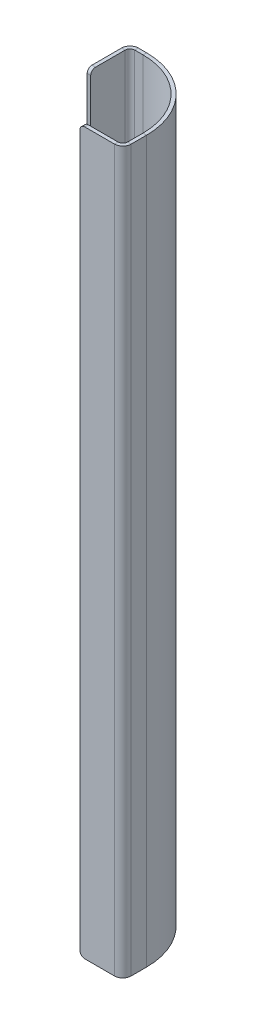
ISO-10303-21;
HEADER;
FILE_DESCRIPTION(('STEP AP214'),'2;1');
FILE_NAME('part.step','',(''),(''),'','','');
FILE_SCHEMA(('AUTOMOTIVE_DESIGN { 1 0 10303 214 1 1 1 1 }'));
ENDSEC;
DATA;
#1=APPLICATION_CONTEXT('core data for automotive mechanical design processes');
#2=APPLICATION_PROTOCOL_DEFINITION('international standard','automotive_design',2000,#1);
#3=PRODUCT_CONTEXT('',#1,'mechanical');
#4=PRODUCT('Part','Part','',(#3));
#5=PRODUCT_RELATED_PRODUCT_CATEGORY('part','',(#4));
#6=PRODUCT_DEFINITION_FORMATION('','',#4);
#7=PRODUCT_DEFINITION_CONTEXT('part definition',#1,'design');
#8=PRODUCT_DEFINITION('design','',#6,#7);
#9=PRODUCT_DEFINITION_SHAPE('','',#8);
#10=(LENGTH_UNIT() NAMED_UNIT(*) SI_UNIT(.MILLI.,.METRE.));
#11=(NAMED_UNIT(*) PLANE_ANGLE_UNIT() SI_UNIT($,.RADIAN.));
#12=(NAMED_UNIT(*) SI_UNIT($,.STERADIAN.) SOLID_ANGLE_UNIT());
#13=UNCERTAINTY_MEASURE_WITH_UNIT(LENGTH_MEASURE(1.E-05),#10,'distance_accuracy_value','');
#14=(GEOMETRIC_REPRESENTATION_CONTEXT(3) GLOBAL_UNCERTAINTY_ASSIGNED_CONTEXT((#13)) GLOBAL_UNIT_ASSIGNED_CONTEXT((#10,
#11,#12)) REPRESENTATION_CONTEXT('',''));
#15=CARTESIAN_POINT('',(0.,0.,0.));
#16=DIRECTION('',(0.,0.,1.));
#17=DIRECTION('',(1.,0.,0.));
#18=AXIS2_PLACEMENT_3D('',#15,#16,#17);
#19=CARTESIAN_POINT('',(0.,303.,-1.5));
#20=DIRECTION('',(0.,1.,0.));
#21=DIRECTION('',(0.,0.,1.));
#22=AXIS2_PLACEMENT_3D('',#19,#20,#21);
#23=PLANE('',#22);
#24=DIRECTION('',(-1.,0.,0.));
#25=VECTOR('',#24,1.);
#26=CARTESIAN_POINT('',(0.,303.,0.));
#27=LINE('',#26,#25);
#28=CARTESIAN_POINT('',(3.5,303.,0.));
#29=VERTEX_POINT('',#28);
#30=CARTESIAN_POINT('',(0.,303.,0.));
#31=VERTEX_POINT('',#30);
#32=EDGE_CURVE('E377',#29,#31,#27,.T.);
#33=ORIENTED_EDGE('',*,*,#32,.F.);
#34=DIRECTION('',(0.,0.,1.));
#35=VECTOR('',#34,1.);
#36=CARTESIAN_POINT('',(3.5,303.,-1.5));
#37=LINE('',#36,#35);
#38=CARTESIAN_POINT('',(3.5,303.,-1.5));
#39=VERTEX_POINT('',#38);
#40=EDGE_CURVE('E399',#39,#29,#37,.T.);
#41=ORIENTED_EDGE('',*,*,#40,.F.);
#42=DIRECTION('',(-1.,0.,0.));
#43=VECTOR('',#42,1.);
#44=CARTESIAN_POINT('',(0.,303.,-1.5));
#45=LINE('',#44,#43);
#46=CARTESIAN_POINT('',(0.,303.,-1.5));
#47=VERTEX_POINT('',#46);
#48=EDGE_CURVE('E383',#39,#47,#45,.T.);
#49=ORIENTED_EDGE('',*,*,#48,.T.);
#50=DIRECTION('',(0.,0.,1.));
#51=VECTOR('',#50,1.);
#52=CARTESIAN_POINT('',(0.,303.,-1.5));
#53=LINE('',#52,#51);
#54=EDGE_CURVE('E396',#47,#31,#53,.T.);
#55=ORIENTED_EDGE('',*,*,#54,.T.);
#56=EDGE_LOOP('',(#33,#41,#49,#55));
#57=FACE_BOUND('',#56,.T.);
#58=ADVANCED_FACE('F97',(#57),#23,.T.);
#59=CARTESIAN_POINT('',(0.,0.,-1.5));
#60=DIRECTION('',(0.,-1.,0.));
#61=DIRECTION('',(0.,0.,-1.));
#62=AXIS2_PLACEMENT_3D('',#59,#60,#61);
#63=PLANE('',#62);
#64=DIRECTION('',(1.,0.,0.));
#65=VECTOR('',#64,1.);
#66=CARTESIAN_POINT('',(0.,0.,0.));
#67=LINE('',#66,#65);
#68=CARTESIAN_POINT('',(0.,0.,0.));
#69=VERTEX_POINT('',#68);
#70=CARTESIAN_POINT('',(3.5,0.,0.));
#71=VERTEX_POINT('',#70);
#72=EDGE_CURVE('E389',#69,#71,#67,.T.);
#73=ORIENTED_EDGE('',*,*,#72,.F.);
#74=DIRECTION('',(0.,0.,1.));
#75=VECTOR('',#74,1.);
#76=CARTESIAN_POINT('',(0.,0.,-1.5));
#77=LINE('',#76,#75);
#78=CARTESIAN_POINT('',(0.,0.,-1.5));
#79=VERTEX_POINT('',#78);
#80=EDGE_CURVE('E386',#79,#69,#77,.T.);
#81=ORIENTED_EDGE('',*,*,#80,.F.);
#82=DIRECTION('',(1.,0.,0.));
#83=VECTOR('',#82,1.);
#84=CARTESIAN_POINT('',(0.,0.,-1.5));
#85=LINE('',#84,#83);
#86=CARTESIAN_POINT('',(3.5,0.,-1.5));
#87=VERTEX_POINT('',#86);
#88=EDGE_CURVE('E376',#79,#87,#85,.T.);
#89=ORIENTED_EDGE('',*,*,#88,.T.);
#90=DIRECTION('',(0.,0.,1.));
#91=VECTOR('',#90,1.);
#92=CARTESIAN_POINT('',(3.5,0.,-1.5));
#93=LINE('',#92,#91);
#94=EDGE_CURVE('E402',#87,#71,#93,.T.);
#95=ORIENTED_EDGE('',*,*,#94,.T.);
#96=EDGE_LOOP('',(#73,#81,#89,#95));
#97=FACE_BOUND('',#96,.T.);
#98=ADVANCED_FACE('F486',(#97),#63,.T.);
#99=CARTESIAN_POINT('',(0.,0.,-1.5));
#100=DIRECTION('',(0.,0.,-1.));
#101=DIRECTION('',(-1.,0.,0.));
#102=AXIS2_PLACEMENT_3D('',#99,#100,#101);
#103=PLANE('',#102);
#104=DIRECTION('',(0.,-1.,0.));
#105=VECTOR('',#104,1.);
#106=CARTESIAN_POINT('',(0.,0.,-1.5));
#107=LINE('',#106,#105);
#108=EDGE_CURVE('E373',#47,#79,#107,.T.);
#109=ORIENTED_EDGE('',*,*,#108,.F.);
#110=ORIENTED_EDGE('',*,*,#48,.F.);
#111=DIRECTION('',(0.,1.,0.));
#112=VECTOR('',#111,1.);
#113=CARTESIAN_POINT('',(3.5,0.,-1.5));
#114=LINE('',#113,#112);
#115=EDGE_CURVE('E380',#87,#39,#114,.T.);
#116=ORIENTED_EDGE('',*,*,#115,.F.);
#117=ORIENTED_EDGE('',*,*,#88,.F.);
#118=EDGE_LOOP('',(#109,#110,#116,#117));
#119=FACE_BOUND('',#118,.T.);
#120=ADVANCED_FACE('F491',(#119),#103,.T.);
#121=CARTESIAN_POINT('',(0.,0.,0.));
#122=DIRECTION('',(0.,0.,-1.));
#123=DIRECTION('',(-1.,0.,0.));
#124=AXIS2_PLACEMENT_3D('',#121,#122,#123);
#125=PLANE('',#124);
#126=DIRECTION('',(0.,-1.,0.));
#127=VECTOR('',#126,1.);
#128=CARTESIAN_POINT('',(0.,0.,0.));
#129=LINE('',#128,#127);
#130=EDGE_CURVE('E364',#31,#69,#129,.T.);
#131=ORIENTED_EDGE('',*,*,#130,.T.);
#132=ORIENTED_EDGE('',*,*,#72,.T.);
#133=DIRECTION('',(0.,1.,0.));
#134=VECTOR('',#133,1.);
#135=CARTESIAN_POINT('',(3.5,0.,0.));
#136=LINE('',#135,#134);
#137=EDGE_CURVE('E392',#71,#29,#136,.T.);
#138=ORIENTED_EDGE('',*,*,#137,.T.);
#139=ORIENTED_EDGE('',*,*,#32,.T.);
#140=EDGE_LOOP('',(#131,#132,#138,#139));
#141=FACE_BOUND('',#140,.T.);
#142=ADVANCED_FACE('F472',(#141),#125,.F.);
#143=CARTESIAN_POINT('',(3.49999999999999,0.,28.5));
#144=DIRECTION('',(0.,-1.,0.));
#145=DIRECTION('',(0.,0.,-1.));
#146=AXIS2_PLACEMENT_3D('',#143,#144,#145);
#147=PLANE('',#146);
#148=DIRECTION('',(1.,0.,0.));
#149=VECTOR('',#148,1.);
#150=CARTESIAN_POINT('',(33.5,0.,28.4999999999999));
#151=LINE('',#150,#149);
#152=CARTESIAN_POINT('',(32.,0.,28.4999999999999));
#153=VERTEX_POINT('',#152);
#154=CARTESIAN_POINT('',(33.5,0.,28.4999999999999));
#155=VERTEX_POINT('',#154);
#156=EDGE_CURVE('E323',#153,#155,#151,.T.);
#157=ORIENTED_EDGE('',*,*,#156,.F.);
#158=CARTESIAN_POINT('',(3.49999999999999,0.,28.5));
#159=DIRECTION('',(0.,1.,0.));
#160=DIRECTION('',(0.,0.,1.));
#161=AXIS2_PLACEMENT_3D('',#158,#159,#160);
#162=CIRCLE('',#161,28.5);
#163=EDGE_CURVE('E368',#71,#153,#162,.F.);
#164=ORIENTED_EDGE('',*,*,#163,.F.);
#165=ORIENTED_EDGE('',*,*,#94,.F.);
#166=CARTESIAN_POINT('',(3.49999999999999,0.,28.5));
#167=DIRECTION('',(0.,1.,0.));
#168=DIRECTION('',(0.,0.,1.));
#169=AXIS2_PLACEMENT_3D('',#166,#167,#168);
#170=CIRCLE('',#169,30.);
#171=EDGE_CURVE('E361',#87,#155,#170,.F.);
#172=ORIENTED_EDGE('',*,*,#171,.T.);
#173=EDGE_LOOP('',(#157,#164,#165,#172));
#174=FACE_BOUND('',#173,.T.);
#175=ADVANCED_FACE('F780',(#174),#147,.T.);
#176=CARTESIAN_POINT('',(3.50000000000001,303.,28.5));
#177=DIRECTION('',(0.,-1.,0.));
#178=DIRECTION('',(0.,0.,-1.));
#179=AXIS2_PLACEMENT_3D('',#176,#177,#178);
#180=PLANE('',#179);
#181=CARTESIAN_POINT('',(3.50000000000001,303.,28.5));
#182=DIRECTION('',(0.,1.,0.));
#183=DIRECTION('',(0.,0.,1.));
#184=AXIS2_PLACEMENT_3D('',#181,#182,#183);
#185=CIRCLE('',#184,28.5);
#186=CARTESIAN_POINT('',(32.,303.,28.4999999999999));
#187=VERTEX_POINT('',#186);
#188=EDGE_CURVE('E334',#187,#29,#185,.T.);
#189=ORIENTED_EDGE('',*,*,#188,.F.);
#190=DIRECTION('',(1.,0.,0.));
#191=VECTOR('',#190,1.);
#192=CARTESIAN_POINT('',(32.,303.,28.4999999999999));
#193=LINE('',#192,#191);
#194=CARTESIAN_POINT('',(33.5,303.,28.4999999999999));
#195=VERTEX_POINT('',#194);
#196=EDGE_CURVE('E354',#187,#195,#193,.T.);
#197=ORIENTED_EDGE('',*,*,#196,.T.);
#198=CARTESIAN_POINT('',(3.50000000000001,303.,28.5));
#199=DIRECTION('',(0.,1.,0.));
#200=DIRECTION('',(0.,0.,1.));
#201=AXIS2_PLACEMENT_3D('',#198,#199,#200);
#202=CIRCLE('',#201,30.);
#203=EDGE_CURVE('E365',#195,#39,#202,.T.);
#204=ORIENTED_EDGE('',*,*,#203,.T.);
#205=ORIENTED_EDGE('',*,*,#40,.T.);
#206=EDGE_LOOP('',(#189,#197,#204,#205));
#207=FACE_BOUND('',#206,.T.);
#208=ADVANCED_FACE('F770',(#207),#180,.F.);
#209=CARTESIAN_POINT('',(3.50000000000001,303.,28.5));
#210=DIRECTION('',(0.,1.,0.));
#211=DIRECTION('',(1.,0.,0.));
#212=AXIS2_PLACEMENT_3D('',#209,#210,#211);
#213=CYLINDRICAL_SURFACE('',#212,30.);
#214=ORIENTED_EDGE('',*,*,#115,.T.);
#215=ORIENTED_EDGE('',*,*,#203,.F.);
#216=DIRECTION('',(0.,1.,0.));
#217=VECTOR('',#216,1.);
#218=CARTESIAN_POINT('',(33.5,0.,28.4999999999999));
#219=LINE('',#218,#217);
#220=EDGE_CURVE('E351',#155,#195,#219,.T.);
#221=ORIENTED_EDGE('',*,*,#220,.F.);
#222=ORIENTED_EDGE('',*,*,#171,.F.);
#223=EDGE_LOOP('',(#214,#215,#221,#222));
#224=FACE_BOUND('',#223,.T.);
#225=ADVANCED_FACE('F760',(#224),#213,.T.);
#226=CARTESIAN_POINT('',(3.50000000000001,303.,28.5));
#227=DIRECTION('',(0.,1.,0.));
#228=DIRECTION('',(1.,0.,0.));
#229=AXIS2_PLACEMENT_3D('',#226,#227,#228);
#230=CYLINDRICAL_SURFACE('',#229,28.5);
#231=ORIENTED_EDGE('',*,*,#137,.F.);
#232=ORIENTED_EDGE('',*,*,#163,.T.);
#233=DIRECTION('',(0.,-1.,0.));
#234=VECTOR('',#233,1.);
#235=CARTESIAN_POINT('',(32.,0.,28.4999999999999));
#236=LINE('',#235,#234);
#237=EDGE_CURVE('E357',#153,#187,#236,.F.);
#238=ORIENTED_EDGE('',*,*,#237,.T.);
#239=ORIENTED_EDGE('',*,*,#188,.T.);
#240=EDGE_LOOP('',(#231,#232,#238,#239));
#241=FACE_BOUND('',#240,.T.);
#242=ADVANCED_FACE('F750',(#241),#230,.F.);
#243=CARTESIAN_POINT('',(33.4999999999999,303.,0.));
#244=DIRECTION('',(0.,1.,0.));
#245=DIRECTION('',(0.,0.,1.));
#246=AXIS2_PLACEMENT_3D('',#243,#244,#245);
#247=PLANE('',#246);
#248=DIRECTION('',(0.,0.,-1.));
#249=VECTOR('',#248,1.);
#250=CARTESIAN_POINT('',(33.4999999999999,303.,0.));
#251=LINE('',#250,#249);
#252=CARTESIAN_POINT('',(33.5,303.,35.));
#253=VERTEX_POINT('',#252);
#254=EDGE_CURVE('E338',#253,#195,#251,.T.);
#255=ORIENTED_EDGE('',*,*,#254,.T.);
#256=ORIENTED_EDGE('',*,*,#196,.F.);
#257=DIRECTION('',(0.,0.,1.));
#258=VECTOR('',#257,1.);
#259=CARTESIAN_POINT('',(31.9999999999999,303.,0.));
#260=LINE('',#259,#258);
#261=CARTESIAN_POINT('',(32.,303.,35.));
#262=VERTEX_POINT('',#261);
#263=EDGE_CURVE('E344',#262,#187,#260,.F.);
#264=ORIENTED_EDGE('',*,*,#263,.F.);
#265=DIRECTION('',(-1.,0.,0.));
#266=VECTOR('',#265,1.);
#267=CARTESIAN_POINT('',(33.5,303.,35.));
#268=LINE('',#267,#266);
#269=EDGE_CURVE('E332',#253,#262,#268,.T.);
#270=ORIENTED_EDGE('',*,*,#269,.F.);
#271=EDGE_LOOP('',(#255,#256,#264,#270));
#272=FACE_BOUND('',#271,.T.);
#273=ADVANCED_FACE('F740',(#272),#247,.T.);
#274=CARTESIAN_POINT('',(33.5,0.,35.));
#275=DIRECTION('',(0.,-1.,0.));
#276=DIRECTION('',(0.,0.,-1.));
#277=AXIS2_PLACEMENT_3D('',#274,#275,#276);
#278=PLANE('',#277);
#279=DIRECTION('',(0.,0.,-1.));
#280=VECTOR('',#279,1.);
#281=CARTESIAN_POINT('',(31.9999999999999,0.,0.));
#282=LINE('',#281,#280);
#283=CARTESIAN_POINT('',(32.,0.,35.));
#284=VERTEX_POINT('',#283);
#285=EDGE_CURVE('E349',#153,#284,#282,.F.);
#286=ORIENTED_EDGE('',*,*,#285,.F.);
#287=ORIENTED_EDGE('',*,*,#156,.T.);
#288=DIRECTION('',(0.,0.,1.));
#289=VECTOR('',#288,1.);
#290=CARTESIAN_POINT('',(33.5,0.,35.));
#291=LINE('',#290,#289);
#292=CARTESIAN_POINT('',(33.5,0.,35.));
#293=VERTEX_POINT('',#292);
#294=EDGE_CURVE('E342',#155,#293,#291,.T.);
#295=ORIENTED_EDGE('',*,*,#294,.T.);
#296=DIRECTION('',(-1.,0.,0.));
#297=VECTOR('',#296,1.);
#298=CARTESIAN_POINT('',(33.5,0.,35.));
#299=LINE('',#298,#297);
#300=EDGE_CURVE('E335',#293,#284,#299,.T.);
#301=ORIENTED_EDGE('',*,*,#300,.T.);
#302=EDGE_LOOP('',(#286,#287,#295,#301));
#303=FACE_BOUND('',#302,.T.);
#304=ADVANCED_FACE('F730',(#303),#278,.T.);
#305=CARTESIAN_POINT('',(33.4999999999999,0.,0.));
#306=DIRECTION('',(1.,0.,0.));
#307=DIRECTION('',(0.,0.,-1.));
#308=AXIS2_PLACEMENT_3D('',#305,#306,#307);
#309=PLANE('',#308);
#310=ORIENTED_EDGE('',*,*,#294,.F.);
#311=ORIENTED_EDGE('',*,*,#220,.T.);
#312=ORIENTED_EDGE('',*,*,#254,.F.);
#313=DIRECTION('',(0.,1.,0.));
#314=VECTOR('',#313,1.);
#315=CARTESIAN_POINT('',(33.5,303.,35.));
#316=LINE('',#315,#314);
#317=EDGE_CURVE('E246',#293,#253,#316,.T.);
#318=ORIENTED_EDGE('',*,*,#317,.F.);
#319=EDGE_LOOP('',(#310,#311,#312,#318));
#320=FACE_BOUND('',#319,.T.);
#321=ADVANCED_FACE('F721',(#320),#309,.T.);
#322=CARTESIAN_POINT('',(31.9999999999999,0.,0.));
#323=DIRECTION('',(1.,0.,0.));
#324=DIRECTION('',(0.,0.,-1.));
#325=AXIS2_PLACEMENT_3D('',#322,#323,#324);
#326=PLANE('',#325);
#327=ORIENTED_EDGE('',*,*,#237,.F.);
#328=ORIENTED_EDGE('',*,*,#285,.T.);
#329=DIRECTION('',(0.,-1.,0.));
#330=VECTOR('',#329,1.);
#331=CARTESIAN_POINT('',(32.,0.,35.));
#332=LINE('',#331,#330);
#333=EDGE_CURVE('E347',#284,#262,#332,.F.);
#334=ORIENTED_EDGE('',*,*,#333,.T.);
#335=ORIENTED_EDGE('',*,*,#263,.T.);
#336=EDGE_LOOP('',(#327,#328,#334,#335));
#337=FACE_BOUND('',#336,.T.);
#338=ADVANCED_FACE('F713',(#337),#326,.F.);
#339=CARTESIAN_POINT('',(0.,303.,2.));
#340=DIRECTION('',(0.,1.,0.));
#341=DIRECTION('',(0.,0.,1.));
#342=AXIS2_PLACEMENT_3D('',#339,#340,#341);
#343=PLANE('',#342);
#344=DIRECTION('',(1.,0.,0.));
#345=VECTOR('',#344,1.);
#346=CARTESIAN_POINT('',(-3.5,303.,1.99999999999999));
#347=LINE('',#346,#345);
#348=CARTESIAN_POINT('',(-2.,303.,1.99999999999999));
#349=VERTEX_POINT('',#348);
#350=CARTESIAN_POINT('',(-3.5,303.,1.99999999999999));
#351=VERTEX_POINT('',#350);
#352=EDGE_CURVE('E292',#349,#351,#347,.F.);
#353=ORIENTED_EDGE('',*,*,#352,.F.);
#354=CARTESIAN_POINT('',(0.,303.,2.));
#355=DIRECTION('',(0.,-1.,0.));
#356=DIRECTION('',(0.,0.,-1.));
#357=AXIS2_PLACEMENT_3D('',#354,#355,#356);
#358=CIRCLE('',#357,2.);
#359=EDGE_CURVE('E327',#31,#349,#358,.F.);
#360=ORIENTED_EDGE('',*,*,#359,.F.);
#361=ORIENTED_EDGE('',*,*,#54,.F.);
#362=CARTESIAN_POINT('',(0.,303.,2.));
#363=DIRECTION('',(0.,-1.,0.));
#364=DIRECTION('',(0.,0.,-1.));
#365=AXIS2_PLACEMENT_3D('',#362,#363,#364);
#366=CIRCLE('',#365,3.5);
#367=EDGE_CURVE('E320',#47,#351,#366,.F.);
#368=ORIENTED_EDGE('',*,*,#367,.T.);
#369=EDGE_LOOP('',(#353,#360,#361,#368));
#370=FACE_BOUND('',#369,.T.);
#371=ADVANCED_FACE('F465',(#370),#343,.T.);
#372=CARTESIAN_POINT('',(0.,0.,2.));
#373=DIRECTION('',(0.,1.,0.));
#374=DIRECTION('',(0.,0.,1.));
#375=AXIS2_PLACEMENT_3D('',#372,#373,#374);
#376=PLANE('',#375);
#377=CARTESIAN_POINT('',(0.,0.,2.));
#378=DIRECTION('',(0.,-1.,0.));
#379=DIRECTION('',(0.,0.,-1.));
#380=AXIS2_PLACEMENT_3D('',#377,#378,#379);
#381=CIRCLE('',#380,2.);
#382=CARTESIAN_POINT('',(-2.,0.,1.99999999999999));
#383=VERTEX_POINT('',#382);
#384=EDGE_CURVE('E299',#383,#69,#381,.T.);
#385=ORIENTED_EDGE('',*,*,#384,.F.);
#386=DIRECTION('',(1.,0.,0.));
#387=VECTOR('',#386,1.);
#388=CARTESIAN_POINT('',(-2.,0.,1.99999999999999));
#389=LINE('',#388,#387);
#390=CARTESIAN_POINT('',(-3.5,0.,1.99999999999999));
#391=VERTEX_POINT('',#390);
#392=EDGE_CURVE('E313',#383,#391,#389,.F.);
#393=ORIENTED_EDGE('',*,*,#392,.T.);
#394=CARTESIAN_POINT('',(0.,0.,2.));
#395=DIRECTION('',(0.,-1.,0.));
#396=DIRECTION('',(0.,0.,-1.));
#397=AXIS2_PLACEMENT_3D('',#394,#395,#396);
#398=CIRCLE('',#397,3.5);
#399=EDGE_CURVE('E324',#391,#79,#398,.T.);
#400=ORIENTED_EDGE('',*,*,#399,.T.);
#401=ORIENTED_EDGE('',*,*,#80,.T.);
#402=EDGE_LOOP('',(#385,#393,#400,#401));
#403=FACE_BOUND('',#402,.T.);
#404=ADVANCED_FACE('F459',(#403),#376,.F.);
#405=CARTESIAN_POINT('',(0.,0.,2.));
#406=DIRECTION('',(0.,-1.,0.));
#407=DIRECTION('',(-1.,0.,0.));
#408=AXIS2_PLACEMENT_3D('',#405,#406,#407);
#409=CYLINDRICAL_SURFACE('',#408,3.5);
#410=ORIENTED_EDGE('',*,*,#108,.T.);
#411=ORIENTED_EDGE('',*,*,#399,.F.);
#412=DIRECTION('',(0.,-1.,0.));
#413=VECTOR('',#412,1.);
#414=CARTESIAN_POINT('',(-3.5,303.,1.99999999999999));
#415=LINE('',#414,#413);
#416=EDGE_CURVE('E310',#391,#351,#415,.F.);
#417=ORIENTED_EDGE('',*,*,#416,.T.);
#418=ORIENTED_EDGE('',*,*,#367,.F.);
#419=EDGE_LOOP('',(#410,#411,#417,#418));
#420=FACE_BOUND('',#419,.T.);
#421=ADVANCED_FACE('F462',(#420),#409,.T.);
#422=CARTESIAN_POINT('',(0.,0.,2.));
#423=DIRECTION('',(0.,-1.,0.));
#424=DIRECTION('',(-1.,0.,0.));
#425=AXIS2_PLACEMENT_3D('',#422,#423,#424);
#426=CYLINDRICAL_SURFACE('',#425,2.);
#427=ORIENTED_EDGE('',*,*,#130,.F.);
#428=ORIENTED_EDGE('',*,*,#359,.T.);
#429=DIRECTION('',(0.,-1.,0.));
#430=VECTOR('',#429,1.);
#431=CARTESIAN_POINT('',(-2.,303.,1.99999999999999));
#432=LINE('',#431,#430);
#433=EDGE_CURVE('E316',#349,#383,#432,.T.);
#434=ORIENTED_EDGE('',*,*,#433,.T.);
#435=ORIENTED_EDGE('',*,*,#384,.T.);
#436=EDGE_LOOP('',(#427,#428,#434,#435));
#437=FACE_BOUND('',#436,.T.);
#438=ADVANCED_FACE('F475',(#437),#426,.F.);
#439=CARTESIAN_POINT('',(-3.49999999999999,303.,0.));
#440=DIRECTION('',(0.,-1.,0.));
#441=DIRECTION('',(0.,0.,-1.));
#442=AXIS2_PLACEMENT_3D('',#439,#440,#441);
#443=PLANE('',#442);
#444=DIRECTION('',(0.,0.,-1.));
#445=VECTOR('',#444,1.);
#446=CARTESIAN_POINT('',(-3.49999999999999,303.,0.));
#447=LINE('',#446,#445);
#448=CARTESIAN_POINT('',(-3.50000000000004,303.,14.5));
#449=VERTEX_POINT('',#448);
#450=EDGE_CURVE('E302',#449,#351,#447,.T.);
#451=ORIENTED_EDGE('',*,*,#450,.F.);
#452=DIRECTION('',(1.,0.,0.));
#453=VECTOR('',#452,1.);
#454=CARTESIAN_POINT('',(-3.50000000000004,303.,14.5));
#455=LINE('',#454,#453);
#456=CARTESIAN_POINT('',(-2.00000000000004,303.,14.5));
#457=VERTEX_POINT('',#456);
#458=EDGE_CURVE('E419',#449,#457,#455,.T.);
#459=ORIENTED_EDGE('',*,*,#458,.T.);
#460=DIRECTION('',(0.,0.,1.));
#461=VECTOR('',#460,1.);
#462=CARTESIAN_POINT('',(-1.99999999999999,303.,0.));
#463=LINE('',#462,#461);
#464=EDGE_CURVE('E308',#457,#349,#463,.F.);
#465=ORIENTED_EDGE('',*,*,#464,.T.);
#466=ORIENTED_EDGE('',*,*,#352,.T.);
#467=EDGE_LOOP('',(#451,#459,#465,#466));
#468=FACE_BOUND('',#467,.T.);
#469=ADVANCED_FACE('F441',(#468),#443,.F.);
#470=CARTESIAN_POINT('',(-3.50000000000005,0.,16.5));
#471=DIRECTION('',(0.,1.,0.));
#472=DIRECTION('',(0.,0.,1.));
#473=AXIS2_PLACEMENT_3D('',#470,#471,#472);
#474=PLANE('',#473);
#475=DIRECTION('',(0.,0.,-1.));
#476=VECTOR('',#475,1.);
#477=CARTESIAN_POINT('',(-2.00000000000005,0.,16.5));
#478=LINE('',#477,#476);
#479=CARTESIAN_POINT('',(-2.00000000000004,0.,14.5));
#480=VERTEX_POINT('',#479);
#481=EDGE_CURVE('E306',#383,#480,#478,.F.);
#482=ORIENTED_EDGE('',*,*,#481,.T.);
#483=DIRECTION('',(1.,0.,0.));
#484=VECTOR('',#483,1.);
#485=CARTESIAN_POINT('',(-3.50000000000004,0.,14.5));
#486=LINE('',#485,#484);
#487=CARTESIAN_POINT('',(-3.50000000000004,0.,14.5));
#488=VERTEX_POINT('',#487);
#489=EDGE_CURVE('E105',#480,#488,#486,.F.);
#490=ORIENTED_EDGE('',*,*,#489,.T.);
#491=DIRECTION('',(0.,0.,1.));
#492=VECTOR('',#491,1.);
#493=CARTESIAN_POINT('',(-3.49999999999999,0.,0.));
#494=LINE('',#493,#492);
#495=EDGE_CURVE('E300',#391,#488,#494,.T.);
#496=ORIENTED_EDGE('',*,*,#495,.F.);
#497=ORIENTED_EDGE('',*,*,#392,.F.);
#498=EDGE_LOOP('',(#482,#490,#496,#497));
#499=FACE_BOUND('',#498,.T.);
#500=ADVANCED_FACE('F456',(#499),#474,.F.);
#501=CARTESIAN_POINT('',(-3.49999999999999,0.,0.));
#502=DIRECTION('',(1.,0.,0.));
#503=DIRECTION('',(0.,0.,-1.));
#504=AXIS2_PLACEMENT_3D('',#501,#502,#503);
#505=PLANE('',#504);
#506=DIRECTION('',(0.,1.,0.));
#507=VECTOR('',#506,1.);
#508=CARTESIAN_POINT('',(-3.50000000000005,0.,16.5));
#509=LINE('',#508,#507);
#510=CARTESIAN_POINT('',(-3.50000000000005,2.,16.5));
#511=VERTEX_POINT('',#510);
#512=CARTESIAN_POINT('',(-3.50000000000005,301.,16.5));
#513=VERTEX_POINT('',#512);
#514=EDGE_CURVE('E297',#511,#513,#509,.T.);
#515=ORIENTED_EDGE('',*,*,#514,.T.);
#516=CARTESIAN_POINT('',(-3.50000000000004,301.,14.5));
#517=DIRECTION('',(1.,0.,0.));
#518=DIRECTION('',(0.,0.,-1.));
#519=AXIS2_PLACEMENT_3D('',#516,#517,#518);
#520=CIRCLE('',#519,2.);
#521=EDGE_CURVE('E432',#513,#449,#520,.F.);
#522=ORIENTED_EDGE('',*,*,#521,.T.);
#523=ORIENTED_EDGE('',*,*,#450,.T.);
#524=ORIENTED_EDGE('',*,*,#416,.F.);
#525=ORIENTED_EDGE('',*,*,#495,.T.);
#526=CARTESIAN_POINT('',(-3.50000000000004,2.,14.5));
#527=DIRECTION('',(1.,0.,0.));
#528=DIRECTION('',(0.,0.,-1.));
#529=AXIS2_PLACEMENT_3D('',#526,#527,#528);
#530=CIRCLE('',#529,2.);
#531=EDGE_CURVE('E430',#488,#511,#530,.F.);
#532=ORIENTED_EDGE('',*,*,#531,.T.);
#533=EDGE_LOOP('',(#515,#522,#523,#524,#525,#532));
#534=FACE_BOUND('',#533,.T.);
#535=ADVANCED_FACE('F436',(#534),#505,.F.);
#536=CARTESIAN_POINT('',(-1.99999999999999,0.,0.));
#537=DIRECTION('',(1.,0.,0.));
#538=DIRECTION('',(0.,0.,-1.));
#539=AXIS2_PLACEMENT_3D('',#536,#537,#538);
#540=PLANE('',#539);
#541=ORIENTED_EDGE('',*,*,#464,.F.);
#542=CARTESIAN_POINT('',(-2.00000000000004,301.,14.5));
#543=DIRECTION('',(1.,0.,0.));
#544=DIRECTION('',(0.,0.,-1.));
#545=AXIS2_PLACEMENT_3D('',#542,#543,#544);
#546=CIRCLE('',#545,2.);
#547=CARTESIAN_POINT('',(-2.00000000000005,301.,16.5));
#548=VERTEX_POINT('',#547);
#549=EDGE_CURVE('E424',#457,#548,#546,.T.);
#550=ORIENTED_EDGE('',*,*,#549,.T.);
#551=DIRECTION('',(0.,-1.,0.));
#552=VECTOR('',#551,1.);
#553=CARTESIAN_POINT('',(-2.00000000000005,303.,16.5));
#554=LINE('',#553,#552);
#555=CARTESIAN_POINT('',(-2.00000000000005,2.,16.5));
#556=VERTEX_POINT('',#555);
#557=EDGE_CURVE('E304',#556,#548,#554,.F.);
#558=ORIENTED_EDGE('',*,*,#557,.F.);
#559=CARTESIAN_POINT('',(-2.00000000000004,2.,14.5));
#560=DIRECTION('',(1.,0.,0.));
#561=DIRECTION('',(0.,0.,-1.));
#562=AXIS2_PLACEMENT_3D('',#559,#560,#561);
#563=CIRCLE('',#562,2.);
#564=EDGE_CURVE('E422',#556,#480,#563,.T.);
#565=ORIENTED_EDGE('',*,*,#564,.T.);
#566=ORIENTED_EDGE('',*,*,#481,.F.);
#567=ORIENTED_EDGE('',*,*,#433,.F.);
#568=EDGE_LOOP('',(#541,#550,#558,#565,#566,#567));
#569=FACE_BOUND('',#568,.T.);
#570=ADVANCED_FACE('F447',(#569),#540,.T.);
#571=CARTESIAN_POINT('',(-3.50000000000005,303.,16.5));
#572=DIRECTION('',(0.,0.,-1.));
#573=DIRECTION('',(-1.,0.,0.));
#574=AXIS2_PLACEMENT_3D('',#571,#572,#573);
#575=PLANE('',#574);
#576=ORIENTED_EDGE('',*,*,#557,.T.);
#577=DIRECTION('',(1.,0.,0.));
#578=VECTOR('',#577,1.);
#579=CARTESIAN_POINT('',(-3.50000000000005,301.,16.5));
#580=LINE('',#579,#578);
#581=EDGE_CURVE('E119',#548,#513,#580,.F.);
#582=ORIENTED_EDGE('',*,*,#581,.T.);
#583=ORIENTED_EDGE('',*,*,#514,.F.);
#584=DIRECTION('',(1.,0.,0.));
#585=VECTOR('',#584,1.);
#586=CARTESIAN_POINT('',(-3.50000000000005,2.,16.5));
#587=LINE('',#586,#585);
#588=EDGE_CURVE('E426',#511,#556,#587,.T.);
#589=ORIENTED_EDGE('',*,*,#588,.T.);
#590=EDGE_LOOP('',(#576,#582,#583,#589));
#591=FACE_BOUND('',#590,.T.);
#592=ADVANCED_FACE('F449',(#591),#575,.F.);
#593=CARTESIAN_POINT('',(30.,0.,35.));
#594=DIRECTION('',(0.,-1.,0.));
#595=DIRECTION('',(0.,0.,-1.));
#596=AXIS2_PLACEMENT_3D('',#593,#594,#595);
#597=PLANE('',#596);
#598=DIRECTION('',(0.,0.,-1.));
#599=VECTOR('',#598,1.);
#600=CARTESIAN_POINT('',(30.,0.,38.5));
#601=LINE('',#600,#599);
#602=CARTESIAN_POINT('',(30.0000000000001,0.,37.));
#603=VERTEX_POINT('',#602);
#604=CARTESIAN_POINT('',(30.0000000000001,0.,38.5));
#605=VERTEX_POINT('',#604);
#606=EDGE_CURVE('E289',#603,#605,#601,.F.);
#607=ORIENTED_EDGE('',*,*,#606,.F.);
#608=CARTESIAN_POINT('',(30.,0.,35.));
#609=DIRECTION('',(0.,1.,0.));
#610=DIRECTION('',(0.,0.,1.));
#611=AXIS2_PLACEMENT_3D('',#608,#609,#610);
#612=CIRCLE('',#611,2.);
#613=EDGE_CURVE('E250',#284,#603,#612,.F.);
#614=ORIENTED_EDGE('',*,*,#613,.F.);
#615=ORIENTED_EDGE('',*,*,#300,.F.);
#616=CARTESIAN_POINT('',(30.,0.,35.));
#617=DIRECTION('',(0.,1.,0.));
#618=DIRECTION('',(0.,0.,1.));
#619=AXIS2_PLACEMENT_3D('',#616,#617,#618);
#620=CIRCLE('',#619,3.5);
#621=EDGE_CURVE('E249',#293,#605,#620,.F.);
#622=ORIENTED_EDGE('',*,*,#621,.T.);
#623=EDGE_LOOP('',(#607,#614,#615,#622));
#624=FACE_BOUND('',#623,.T.);
#625=ADVANCED_FACE('F520',(#624),#597,.T.);
#626=CARTESIAN_POINT('',(30.,303.,35.));
#627=DIRECTION('',(0.,-1.,0.));
#628=DIRECTION('',(0.,0.,-1.));
#629=AXIS2_PLACEMENT_3D('',#626,#627,#628);
#630=PLANE('',#629);
#631=CARTESIAN_POINT('',(30.,303.,35.));
#632=DIRECTION('',(0.,1.,0.));
#633=DIRECTION('',(0.,0.,1.));
#634=AXIS2_PLACEMENT_3D('',#631,#632,#633);
#635=CIRCLE('',#634,2.);
#636=CARTESIAN_POINT('',(30.0000000000001,303.,37.));
#637=VERTEX_POINT('',#636);
#638=EDGE_CURVE('E257',#637,#262,#635,.T.);
#639=ORIENTED_EDGE('',*,*,#638,.F.);
#640=DIRECTION('',(0.,0.,-1.));
#641=VECTOR('',#640,1.);
#642=CARTESIAN_POINT('',(30.,303.,37.));
#643=LINE('',#642,#641);
#644=CARTESIAN_POINT('',(30.,303.,38.5));
#645=VERTEX_POINT('',#644);
#646=EDGE_CURVE('E254',#637,#645,#643,.F.);
#647=ORIENTED_EDGE('',*,*,#646,.T.);
#648=CARTESIAN_POINT('',(30.,303.,35.));
#649=DIRECTION('',(0.,1.,0.));
#650=DIRECTION('',(0.,0.,1.));
#651=AXIS2_PLACEMENT_3D('',#648,#649,#650);
#652=CIRCLE('',#651,3.5);
#653=EDGE_CURVE('E238',#645,#253,#652,.T.);
#654=ORIENTED_EDGE('',*,*,#653,.T.);
#655=ORIENTED_EDGE('',*,*,#269,.T.);
#656=EDGE_LOOP('',(#639,#647,#654,#655));
#657=FACE_BOUND('',#656,.T.);
#658=ADVANCED_FACE('F255',(#657),#630,.F.);
#659=CARTESIAN_POINT('',(30.,303.,35.));
#660=DIRECTION('',(0.,1.,0.));
#661=DIRECTION('',(0.,0.,1.));
#662=AXIS2_PLACEMENT_3D('',#659,#660,#661);
#663=CYLINDRICAL_SURFACE('',#662,3.5);
#664=ORIENTED_EDGE('',*,*,#317,.T.);
#665=ORIENTED_EDGE('',*,*,#653,.F.);
#666=DIRECTION('',(0.,1.,0.));
#667=VECTOR('',#666,1.);
#668=CARTESIAN_POINT('',(30.,0.,38.5));
#669=LINE('',#668,#667);
#670=EDGE_CURVE('E243',#645,#605,#669,.F.);
#671=ORIENTED_EDGE('',*,*,#670,.T.);
#672=ORIENTED_EDGE('',*,*,#621,.F.);
#673=EDGE_LOOP('',(#664,#665,#671,#672));
#674=FACE_BOUND('',#673,.T.);
#675=ADVANCED_FACE('F240',(#674),#663,.T.);
#676=CARTESIAN_POINT('',(30.,303.,35.));
#677=DIRECTION('',(0.,1.,0.));
#678=DIRECTION('',(0.,0.,1.));
#679=AXIS2_PLACEMENT_3D('',#676,#677,#678);
#680=CYLINDRICAL_SURFACE('',#679,2.);
#681=ORIENTED_EDGE('',*,*,#333,.F.);
#682=ORIENTED_EDGE('',*,*,#613,.T.);
#683=DIRECTION('',(0.,1.,0.));
#684=VECTOR('',#683,1.);
#685=CARTESIAN_POINT('',(30.,0.,37.));
#686=LINE('',#685,#684);
#687=EDGE_CURVE('E262',#603,#637,#686,.T.);
#688=ORIENTED_EDGE('',*,*,#687,.T.);
#689=ORIENTED_EDGE('',*,*,#638,.T.);
#690=EDGE_LOOP('',(#681,#682,#688,#689));
#691=FACE_BOUND('',#690,.T.);
#692=ADVANCED_FACE('F525',(#691),#680,.F.);
#693=CARTESIAN_POINT('',(15.5,303.,38.5000000000001));
#694=DIRECTION('',(0.,-1.,0.));
#695=DIRECTION('',(0.,0.,-1.));
#696=AXIS2_PLACEMENT_3D('',#693,#694,#695);
#697=PLANE('',#696);
#698=DIRECTION('',(1.,0.,0.));
#699=VECTOR('',#698,1.);
#700=CARTESIAN_POINT('',(15.5,303.,37.0000000000001));
#701=LINE('',#700,#699);
#702=CARTESIAN_POINT('',(17.5,303.,37.0000000000001));
#703=VERTEX_POINT('',#702);
#704=EDGE_CURVE('E271',#637,#703,#701,.F.);
#705=ORIENTED_EDGE('',*,*,#704,.T.);
#706=DIRECTION('',(0.,0.,-1.));
#707=VECTOR('',#706,1.);
#708=CARTESIAN_POINT('',(17.5,303.,38.5000000000001));
#709=LINE('',#708,#707);
#710=CARTESIAN_POINT('',(17.5,303.,38.5000000000001));
#711=VERTEX_POINT('',#710);
#712=EDGE_CURVE('E275',#703,#711,#709,.F.);
#713=ORIENTED_EDGE('',*,*,#712,.T.);
#714=DIRECTION('',(-1.,0.,0.));
#715=VECTOR('',#714,1.);
#716=CARTESIAN_POINT('',(2.67687742079042E-13,303.,38.5000000000002));
#717=LINE('',#716,#715);
#718=EDGE_CURVE('E267',#645,#711,#717,.T.);
#719=ORIENTED_EDGE('',*,*,#718,.F.);
#720=ORIENTED_EDGE('',*,*,#646,.F.);
#721=EDGE_LOOP('',(#705,#713,#719,#720));
#722=FACE_BOUND('',#721,.T.);
#723=ADVANCED_FACE('F273',(#722),#697,.F.);
#724=CARTESIAN_POINT('',(32.,0.,38.5));
#725=DIRECTION('',(0.,1.,0.));
#726=DIRECTION('',(0.,0.,1.));
#727=AXIS2_PLACEMENT_3D('',#724,#725,#726);
#728=PLANE('',#727);
#729=DIRECTION('',(1.,0.,0.));
#730=VECTOR('',#729,1.);
#731=CARTESIAN_POINT('',(2.67687742079042E-13,0.,38.5000000000002));
#732=LINE('',#731,#730);
#733=CARTESIAN_POINT('',(17.5,0.,38.5000000000001));
#734=VERTEX_POINT('',#733);
#735=EDGE_CURVE('E270',#734,#605,#732,.T.);
#736=ORIENTED_EDGE('',*,*,#735,.F.);
#737=DIRECTION('',(0.,0.,-1.));
#738=VECTOR('',#737,1.);
#739=CARTESIAN_POINT('',(17.5,0.,38.5000000000001));
#740=LINE('',#739,#738);
#741=CARTESIAN_POINT('',(17.5,0.,37.0000000000001));
#742=VERTEX_POINT('',#741);
#743=EDGE_CURVE('E13',#734,#742,#740,.T.);
#744=ORIENTED_EDGE('',*,*,#743,.T.);
#745=DIRECTION('',(-1.,0.,0.));
#746=VECTOR('',#745,1.);
#747=CARTESIAN_POINT('',(32.,0.,37.));
#748=LINE('',#747,#746);
#749=EDGE_CURVE('E277',#742,#603,#748,.F.);
#750=ORIENTED_EDGE('',*,*,#749,.T.);
#751=ORIENTED_EDGE('',*,*,#606,.T.);
#752=EDGE_LOOP('',(#736,#744,#750,#751));
#753=FACE_BOUND('',#752,.T.);
#754=ADVANCED_FACE('F515',(#753),#728,.F.);
#755=CARTESIAN_POINT('',(2.67687742079042E-13,0.,38.5000000000002));
#756=DIRECTION('',(0.,0.,-1.));
#757=DIRECTION('',(-1.,0.,0.));
#758=AXIS2_PLACEMENT_3D('',#755,#756,#757);
#759=PLANE('',#758);
#760=ORIENTED_EDGE('',*,*,#718,.T.);
#761=CARTESIAN_POINT('',(17.5,301.,38.5000000000001));
#762=DIRECTION('',(0.,0.,-1.));
#763=DIRECTION('',(-1.,0.,0.));
#764=AXIS2_PLACEMENT_3D('',#761,#762,#763);
#765=CIRCLE('',#764,2.);
#766=CARTESIAN_POINT('',(15.5,301.,38.5000000000001));
#767=VERTEX_POINT('',#766);
#768=EDGE_CURVE('E417',#711,#767,#765,.F.);
#769=ORIENTED_EDGE('',*,*,#768,.T.);
#770=DIRECTION('',(0.,-1.,0.));
#771=VECTOR('',#770,1.);
#772=CARTESIAN_POINT('',(15.5,0.,38.5000000000001));
#773=LINE('',#772,#771);
#774=CARTESIAN_POINT('',(15.5,2.,38.5000000000001));
#775=VERTEX_POINT('',#774);
#776=EDGE_CURVE('E276',#767,#775,#773,.T.);
#777=ORIENTED_EDGE('',*,*,#776,.T.);
#778=CARTESIAN_POINT('',(17.5,2.,38.5000000000001));
#779=DIRECTION('',(0.,0.,-1.));
#780=DIRECTION('',(-1.,0.,0.));
#781=AXIS2_PLACEMENT_3D('',#778,#779,#780);
#782=CIRCLE('',#781,2.);
#783=EDGE_CURVE('E415',#775,#734,#782,.F.);
#784=ORIENTED_EDGE('',*,*,#783,.T.);
#785=ORIENTED_EDGE('',*,*,#735,.T.);
#786=ORIENTED_EDGE('',*,*,#670,.F.);
#787=EDGE_LOOP('',(#760,#769,#777,#784,#785,#786));
#788=FACE_BOUND('',#787,.T.);
#789=ADVANCED_FACE('F266',(#788),#759,.F.);
#790=CARTESIAN_POINT('',(2.57209176996933E-13,0.,37.0000000000002));
#791=DIRECTION('',(0.,0.,-1.));
#792=DIRECTION('',(-1.,0.,0.));
#793=AXIS2_PLACEMENT_3D('',#790,#791,#792);
#794=PLANE('',#793);
#795=DIRECTION('',(0.,1.,0.));
#796=VECTOR('',#795,1.);
#797=CARTESIAN_POINT('',(15.5,0.,37.0000000000001));
#798=LINE('',#797,#796);
#799=CARTESIAN_POINT('',(15.5,301.,37.0000000000001));
#800=VERTEX_POINT('',#799);
#801=CARTESIAN_POINT('',(15.5,2.,37.0000000000001));
#802=VERTEX_POINT('',#801);
#803=EDGE_CURVE('E281',#800,#802,#798,.F.);
#804=ORIENTED_EDGE('',*,*,#803,.F.);
#805=CARTESIAN_POINT('',(17.5,301.,37.0000000000001));
#806=DIRECTION('',(0.,0.,-1.));
#807=DIRECTION('',(-1.,0.,0.));
#808=AXIS2_PLACEMENT_3D('',#805,#806,#807);
#809=CIRCLE('',#808,2.);
#810=EDGE_CURVE('E412',#800,#703,#809,.T.);
#811=ORIENTED_EDGE('',*,*,#810,.T.);
#812=ORIENTED_EDGE('',*,*,#704,.F.);
#813=ORIENTED_EDGE('',*,*,#687,.F.);
#814=ORIENTED_EDGE('',*,*,#749,.F.);
#815=CARTESIAN_POINT('',(17.5,2.,37.0000000000001));
#816=DIRECTION('',(0.,0.,-1.));
#817=DIRECTION('',(-1.,0.,0.));
#818=AXIS2_PLACEMENT_3D('',#815,#816,#817);
#819=CIRCLE('',#818,2.);
#820=EDGE_CURVE('E410',#742,#802,#819,.T.);
#821=ORIENTED_EDGE('',*,*,#820,.T.);
#822=EDGE_LOOP('',(#804,#811,#812,#813,#814,#821));
#823=FACE_BOUND('',#822,.T.);
#824=ADVANCED_FACE('F528',(#823),#794,.T.);
#825=CARTESIAN_POINT('',(15.5,0.,38.5000000000001));
#826=DIRECTION('',(1.,0.,0.));
#827=DIRECTION('',(0.,0.,-1.));
#828=AXIS2_PLACEMENT_3D('',#825,#826,#827);
#829=PLANE('',#828);
#830=ORIENTED_EDGE('',*,*,#776,.F.);
#831=DIRECTION('',(0.,0.,-1.));
#832=VECTOR('',#831,1.);
#833=CARTESIAN_POINT('',(15.5,301.,38.5000000000001));
#834=LINE('',#833,#832);
#835=EDGE_CURVE('E407',#767,#800,#834,.T.);
#836=ORIENTED_EDGE('',*,*,#835,.T.);
#837=ORIENTED_EDGE('',*,*,#803,.T.);
#838=DIRECTION('',(0.,0.,-1.));
#839=VECTOR('',#838,1.);
#840=CARTESIAN_POINT('',(15.5,2.,38.5000000000001));
#841=LINE('',#840,#839);
#842=EDGE_CURVE('E398',#802,#775,#841,.F.);
#843=ORIENTED_EDGE('',*,*,#842,.T.);
#844=EDGE_LOOP('',(#830,#836,#837,#843));
#845=FACE_BOUND('',#844,.T.);
#846=ADVANCED_FACE('F500',(#845),#829,.F.);
#847=CARTESIAN_POINT('',(17.5,301.,38.5000000000001));
#848=DIRECTION('',(0.,0.,-1.));
#849=DIRECTION('',(-1.,0.,0.));
#850=AXIS2_PLACEMENT_3D('',#847,#848,#849);
#851=CYLINDRICAL_SURFACE('',#850,2.);
#852=ORIENTED_EDGE('',*,*,#768,.F.);
#853=ORIENTED_EDGE('',*,*,#712,.F.);
#854=ORIENTED_EDGE('',*,*,#810,.F.);
#855=ORIENTED_EDGE('',*,*,#835,.F.);
#856=EDGE_LOOP('',(#852,#853,#854,#855));
#857=FACE_BOUND('',#856,.T.);
#858=ADVANCED_FACE('F497',(#857),#851,.T.);
#859=CARTESIAN_POINT('',(-3.50000000000004,301.,14.5));
#860=DIRECTION('',(1.,0.,0.));
#861=DIRECTION('',(0.,0.,-1.));
#862=AXIS2_PLACEMENT_3D('',#859,#860,#861);
#863=CYLINDRICAL_SURFACE('',#862,2.);
#864=ORIENTED_EDGE('',*,*,#521,.F.);
#865=ORIENTED_EDGE('',*,*,#581,.F.);
#866=ORIENTED_EDGE('',*,*,#549,.F.);
#867=ORIENTED_EDGE('',*,*,#458,.F.);
#868=EDGE_LOOP('',(#864,#865,#866,#867));
#869=FACE_BOUND('',#868,.T.);
#870=ADVANCED_FACE('F444',(#869),#863,.T.);
#871=CARTESIAN_POINT('',(-3.50000000000004,2.,14.5));
#872=DIRECTION('',(1.,0.,0.));
#873=DIRECTION('',(0.,0.,-1.));
#874=AXIS2_PLACEMENT_3D('',#871,#872,#873);
#875=CYLINDRICAL_SURFACE('',#874,2.);
#876=ORIENTED_EDGE('',*,*,#531,.F.);
#877=ORIENTED_EDGE('',*,*,#489,.F.);
#878=ORIENTED_EDGE('',*,*,#564,.F.);
#879=ORIENTED_EDGE('',*,*,#588,.F.);
#880=EDGE_LOOP('',(#876,#877,#878,#879));
#881=FACE_BOUND('',#880,.T.);
#882=ADVANCED_FACE('F453',(#881),#875,.T.);
#883=CARTESIAN_POINT('',(17.5,2.,38.5000000000001));
#884=DIRECTION('',(0.,0.,-1.));
#885=DIRECTION('',(-1.,0.,0.));
#886=AXIS2_PLACEMENT_3D('',#883,#884,#885);
#887=CYLINDRICAL_SURFACE('',#886,2.);
#888=ORIENTED_EDGE('',*,*,#783,.F.);
#889=ORIENTED_EDGE('',*,*,#842,.F.);
#890=ORIENTED_EDGE('',*,*,#820,.F.);
#891=ORIENTED_EDGE('',*,*,#743,.F.);
#892=EDGE_LOOP('',(#888,#889,#890,#891));
#893=FACE_BOUND('',#892,.T.);
#894=ADVANCED_FACE('F99',(#893),#887,.T.);
#895=CLOSED_SHELL('',(#58,#98,#120,#142,#175,#208,#225,#242,#273,#304,#321,#338,#371,#404,#421,
#438,#469,#500,#535,#570,#592,#625,#658,#675,#692,#723,#754,#789,#824,#846,#858,#870,#882,#894));
#896=MANIFOLD_SOLID_BREP('B2',#895);
#897=ADVANCED_BREP_SHAPE_REPRESENTATION('',(#18,#896),#14);
#898=SHAPE_DEFINITION_REPRESENTATION(#9,#897);
ENDSEC;
END-ISO-10303-21;
